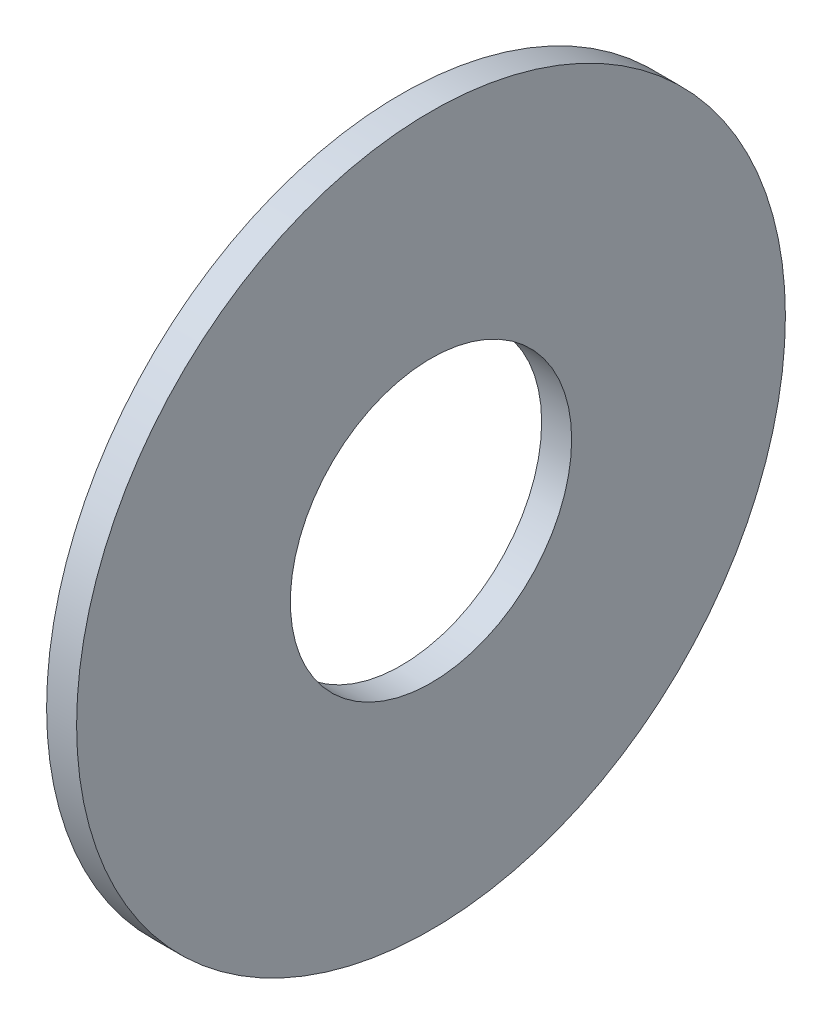
ISO-10303-21;
HEADER;
FILE_DESCRIPTION(('STEP AP214'),'2;1');
FILE_NAME('part.step','',(''),(''),'','','');
FILE_SCHEMA(('AUTOMOTIVE_DESIGN { 1 0 10303 214 1 1 1 1 }'));
ENDSEC;
DATA;
#1=APPLICATION_CONTEXT('core data for automotive mechanical design processes');
#2=APPLICATION_PROTOCOL_DEFINITION('international standard','automotive_design',2000,#1);
#3=PRODUCT_CONTEXT('',#1,'mechanical');
#4=PRODUCT('Part','Part','',(#3));
#5=PRODUCT_RELATED_PRODUCT_CATEGORY('part','',(#4));
#6=PRODUCT_DEFINITION_FORMATION('','',#4);
#7=PRODUCT_DEFINITION_CONTEXT('part definition',#1,'design');
#8=PRODUCT_DEFINITION('design','',#6,#7);
#9=PRODUCT_DEFINITION_SHAPE('','',#8);
#10=(LENGTH_UNIT() NAMED_UNIT(*) SI_UNIT(.MILLI.,.METRE.));
#11=(NAMED_UNIT(*) PLANE_ANGLE_UNIT() SI_UNIT($,.RADIAN.));
#12=(NAMED_UNIT(*) SI_UNIT($,.STERADIAN.) SOLID_ANGLE_UNIT());
#13=UNCERTAINTY_MEASURE_WITH_UNIT(LENGTH_MEASURE(1.E-05),#10,'distance_accuracy_value','');
#14=(GEOMETRIC_REPRESENTATION_CONTEXT(3) GLOBAL_UNCERTAINTY_ASSIGNED_CONTEXT((#13)) GLOBAL_UNIT_ASSIGNED_CONTEXT((#10,
#11,#12)) REPRESENTATION_CONTEXT('',''));
#15=CARTESIAN_POINT('',(0.,0.,0.));
#16=DIRECTION('',(0.,0.,1.));
#17=DIRECTION('',(1.,0.,0.));
#18=AXIS2_PLACEMENT_3D('',#15,#16,#17);
#19=CARTESIAN_POINT('',(0.508,0.,0.));
#20=DIRECTION('',(1.,0.,0.));
#21=DIRECTION('',(0.,0.,-1.));
#22=AXIS2_PLACEMENT_3D('',#19,#20,#21);
#23=PLANE('',#22);
#24=CARTESIAN_POINT('',(0.508,0.,0.));
#25=DIRECTION('',(1.,0.,0.));
#26=DIRECTION('',(0.,0.,-1.));
#27=AXIS2_PLACEMENT_3D('',#24,#25,#26);
#28=CIRCLE('',#27,6.);
#29=CARTESIAN_POINT('',(0.508,0.,-6.));
#30=VERTEX_POINT('',#29);
#31=EDGE_CURVE('E10',#30,#30,#28,.T.);
#32=ORIENTED_EDGE('',*,*,#31,.T.);
#33=EDGE_LOOP('',(#32));
#34=FACE_BOUND('',#33,.T.);
#35=CARTESIAN_POINT('',(0.508,0.,0.));
#36=DIRECTION('',(1.,0.,0.));
#37=DIRECTION('',(0.,0.,-1.));
#38=AXIS2_PLACEMENT_3D('',#35,#36,#37);
#39=CIRCLE('',#38,2.38125);
#40=CARTESIAN_POINT('',(0.508,0.,-2.38125));
#41=VERTEX_POINT('',#40);
#42=EDGE_CURVE('E42',#41,#41,#39,.T.);
#43=ORIENTED_EDGE('',*,*,#42,.F.);
#44=EDGE_LOOP('',(#43));
#45=FACE_BOUND('',#44,.T.);
#46=ADVANCED_FACE('F31',(#34,#45),#23,.T.);
#47=CARTESIAN_POINT('',(0.,0.,0.));
#48=DIRECTION('',(1.,0.,0.));
#49=DIRECTION('',(0.,0.,-1.));
#50=AXIS2_PLACEMENT_3D('',#47,#48,#49);
#51=PLANE('',#50);
#52=CARTESIAN_POINT('',(0.,0.,0.));
#53=DIRECTION('',(1.,0.,0.));
#54=DIRECTION('',(0.,0.,-1.));
#55=AXIS2_PLACEMENT_3D('',#52,#53,#54);
#56=CIRCLE('',#55,6.);
#57=CARTESIAN_POINT('',(0.,0.,-6.));
#58=VERTEX_POINT('',#57);
#59=EDGE_CURVE('E35',#58,#58,#56,.T.);
#60=ORIENTED_EDGE('',*,*,#59,.F.);
#61=EDGE_LOOP('',(#60));
#62=FACE_BOUND('',#61,.T.);
#63=CARTESIAN_POINT('',(0.,0.,0.));
#64=DIRECTION('',(1.,0.,0.));
#65=DIRECTION('',(0.,0.,-1.));
#66=AXIS2_PLACEMENT_3D('',#63,#64,#65);
#67=CIRCLE('',#66,2.38125);
#68=CARTESIAN_POINT('',(0.,0.,-2.38125));
#69=VERTEX_POINT('',#68);
#70=EDGE_CURVE('E44',#69,#69,#67,.T.);
#71=ORIENTED_EDGE('',*,*,#70,.T.);
#72=EDGE_LOOP('',(#71));
#73=FACE_BOUND('',#72,.T.);
#74=ADVANCED_FACE('F54',(#62,#73),#51,.F.);
#75=CARTESIAN_POINT('',(0.508,0.,0.));
#76=DIRECTION('',(-1.,0.,0.));
#77=DIRECTION('',(0.,0.,1.));
#78=AXIS2_PLACEMENT_3D('',#75,#76,#77);
#79=CYLINDRICAL_SURFACE('',#78,6.);
#80=ORIENTED_EDGE('',*,*,#31,.F.);
#81=EDGE_LOOP('',(#80));
#82=FACE_BOUND('',#81,.T.);
#83=ORIENTED_EDGE('',*,*,#59,.T.);
#84=EDGE_LOOP('',(#83));
#85=FACE_BOUND('',#84,.T.);
#86=ADVANCED_FACE('F33',(#82,#85),#79,.T.);
#87=CARTESIAN_POINT('',(0.508,0.,0.));
#88=DIRECTION('',(-1.,0.,0.));
#89=DIRECTION('',(0.,0.,1.));
#90=AXIS2_PLACEMENT_3D('',#87,#88,#89);
#91=CYLINDRICAL_SURFACE('',#90,2.38125);
#92=ORIENTED_EDGE('',*,*,#42,.T.);
#93=EDGE_LOOP('',(#92));
#94=FACE_BOUND('',#93,.T.);
#95=ORIENTED_EDGE('',*,*,#70,.F.);
#96=EDGE_LOOP('',(#95));
#97=FACE_BOUND('',#96,.T.);
#98=ADVANCED_FACE('F50',(#94,#97),#91,.F.);
#99=CLOSED_SHELL('',(#46,#74,#86,#98));
#100=MANIFOLD_SOLID_BREP('B2',#99);
#101=ADVANCED_BREP_SHAPE_REPRESENTATION('',(#18,#100),#14);
#102=SHAPE_DEFINITION_REPRESENTATION(#9,#101);
ENDSEC;
END-ISO-10303-21;
